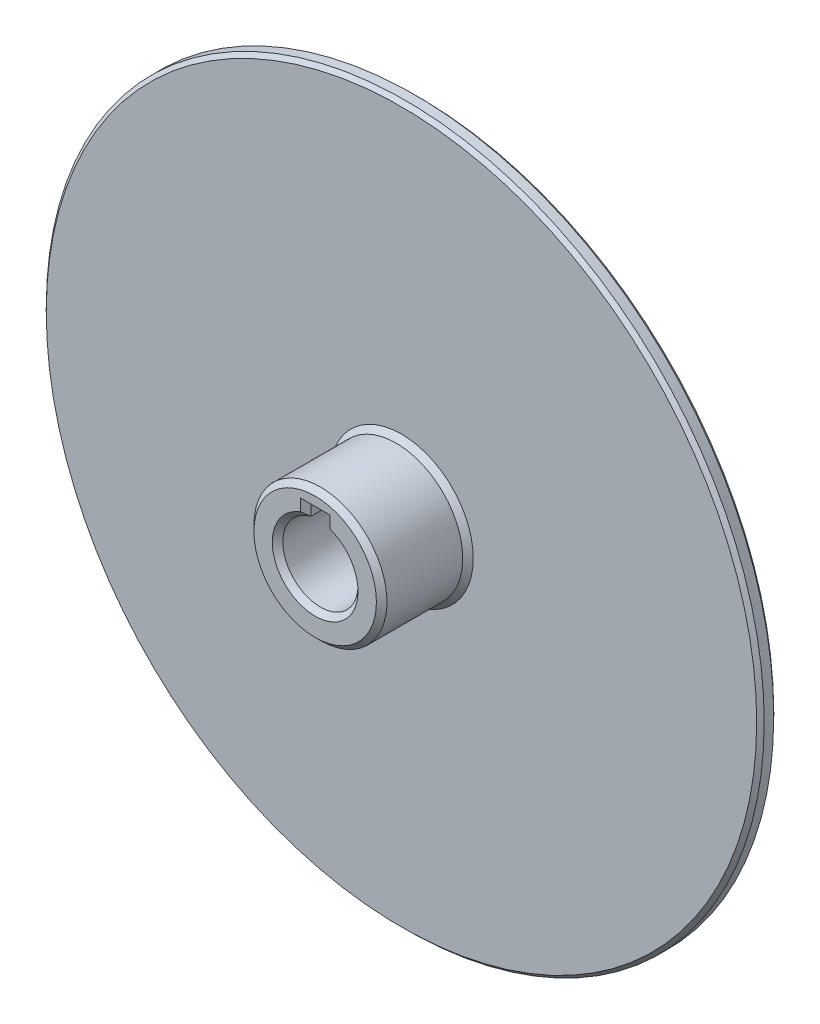
ISO-10303-21;
HEADER;
FILE_DESCRIPTION(('STEP AP214'),'2;1');
FILE_NAME('part.step','',(''),(''),'','','');
FILE_SCHEMA(('AUTOMOTIVE_DESIGN { 1 0 10303 214 1 1 1 1 }'));
ENDSEC;
DATA;
#1=APPLICATION_CONTEXT('core data for automotive mechanical design processes');
#2=APPLICATION_PROTOCOL_DEFINITION('international standard','automotive_design',2000,#1);
#3=PRODUCT_CONTEXT('',#1,'mechanical');
#4=PRODUCT('Part','Part','',(#3));
#5=PRODUCT_RELATED_PRODUCT_CATEGORY('part','',(#4));
#6=PRODUCT_DEFINITION_FORMATION('','',#4);
#7=PRODUCT_DEFINITION_CONTEXT('part definition',#1,'design');
#8=PRODUCT_DEFINITION('design','',#6,#7);
#9=PRODUCT_DEFINITION_SHAPE('','',#8);
#10=(LENGTH_UNIT() NAMED_UNIT(*) SI_UNIT(.MILLI.,.METRE.));
#11=(NAMED_UNIT(*) PLANE_ANGLE_UNIT() SI_UNIT($,.RADIAN.));
#12=(NAMED_UNIT(*) SI_UNIT($,.STERADIAN.) SOLID_ANGLE_UNIT());
#13=UNCERTAINTY_MEASURE_WITH_UNIT(LENGTH_MEASURE(1.E-05),#10,'distance_accuracy_value','');
#14=(GEOMETRIC_REPRESENTATION_CONTEXT(3) GLOBAL_UNCERTAINTY_ASSIGNED_CONTEXT((#13)) GLOBAL_UNIT_ASSIGNED_CONTEXT((#10,
#11,#12)) REPRESENTATION_CONTEXT('',''));
#15=CARTESIAN_POINT('',(0.,0.,0.));
#16=DIRECTION('',(0.,0.,1.));
#17=DIRECTION('',(1.,0.,0.));
#18=AXIS2_PLACEMENT_3D('',#15,#16,#17);
#19=CARTESIAN_POINT('',(0.,0.,5.7658));
#20=DIRECTION('',(0.,0.,-1.));
#21=DIRECTION('',(-1.,0.,0.));
#22=AXIS2_PLACEMENT_3D('',#19,#20,#21);
#23=CYLINDRICAL_SURFACE('',#22,121.3314985735);
#24=CARTESIAN_POINT('',(0.,0.,1.27000000000012));
#25=DIRECTION('',(0.,0.,1.));
#26=DIRECTION('',(1.,0.,0.));
#27=AXIS2_PLACEMENT_3D('',#24,#25,#26);
#28=CIRCLE('',#27,121.3314985735);
#29=CARTESIAN_POINT('',(-121.3314985735,0.,1.27000000000012));
#30=VERTEX_POINT('',#29);
#31=EDGE_CURVE('E329',#30,#30,#28,.T.);
#32=CARTESIAN_POINT('',(0.,0.,4.49580000000024));
#33=DIRECTION('',(0.,0.,1.));
#34=DIRECTION('',(1.,0.,0.));
#35=AXIS2_PLACEMENT_3D('',#32,#33,#34);
#36=CIRCLE('',#35,121.3314985735);
#37=CARTESIAN_POINT('',(-121.3314985735,0.,4.49580000000024));
#38=VERTEX_POINT('',#37);
#39=EDGE_CURVE('E320',#38,#38,#36,.F.);
#40=CARTESIAN_POINT('',(-121.3314985735,0.,1.27000000000012));
#41=CARTESIAN_POINT('',(-121.3314985735,0.,1.30360208333345));
#42=CARTESIAN_POINT('',(-121.3314985735,0.,1.33720416666679));
#43=CARTESIAN_POINT('',(-121.3314985735,0.,1.40440833333346));
#44=CARTESIAN_POINT('',(-121.3314985735,0.,1.43801041666679));
#45=CARTESIAN_POINT('',(-121.3314985735,0.,1.50521458333346));
#46=CARTESIAN_POINT('',(-121.3314985735,0.,1.53881666666679));
#47=CARTESIAN_POINT('',(-121.3314985735,0.,1.60602083333346));
#48=CARTESIAN_POINT('',(-121.3314985735,0.,1.6396229166668));
#49=CARTESIAN_POINT('',(-121.3314985735,0.,1.70682708333347));
#50=CARTESIAN_POINT('',(-121.3314985735,0.,1.7404291666668));
#51=CARTESIAN_POINT('',(-121.3314985735,0.,1.80763333333347));
#52=CARTESIAN_POINT('',(-121.3314985735,0.,1.84123541666681));
#53=CARTESIAN_POINT('',(-121.3314985735,0.,1.90843958333348));
#54=CARTESIAN_POINT('',(-121.3314985735,0.,1.94204166666681));
#55=CARTESIAN_POINT('',(-121.3314985735,0.,2.00924583333348));
#56=CARTESIAN_POINT('',(-121.3314985735,0.,2.04284791666681));
#57=CARTESIAN_POINT('',(-121.3314985735,0.,2.11005208333348));
#58=CARTESIAN_POINT('',(-121.3314985735,0.,2.14365416666682));
#59=CARTESIAN_POINT('',(-121.3314985735,0.,2.21085833333349));
#60=CARTESIAN_POINT('',(-121.3314985735,0.,2.24446041666682));
#61=CARTESIAN_POINT('',(-121.3314985735,0.,2.31166458333349));
#62=CARTESIAN_POINT('',(-121.3314985735,0.,2.34526666666683));
#63=CARTESIAN_POINT('',(-121.3314985735,0.,2.41247083333349));
#64=CARTESIAN_POINT('',(-121.3314985735,0.,2.44607291666683));
#65=CARTESIAN_POINT('',(-121.3314985735,0.,2.5132770833335));
#66=CARTESIAN_POINT('',(-121.3314985735,0.,2.54687916666683));
#67=CARTESIAN_POINT('',(-121.3314985735,0.,2.6140833333335));
#68=CARTESIAN_POINT('',(-121.3314985735,0.,2.64768541666684));
#69=CARTESIAN_POINT('',(-121.3314985735,0.,2.71488958333351));
#70=CARTESIAN_POINT('',(-121.3314985735,0.,2.74849166666684));
#71=CARTESIAN_POINT('',(-121.3314985735,0.,2.81569583333351));
#72=CARTESIAN_POINT('',(-121.3314985735,0.,2.84929791666684));
#73=CARTESIAN_POINT('',(-121.3314985735,0.,2.91650208333351));
#74=CARTESIAN_POINT('',(-121.3314985735,0.,2.95010416666685));
#75=CARTESIAN_POINT('',(-121.3314985735,0.,3.01730833333352));
#76=CARTESIAN_POINT('',(-121.3314985735,0.,3.05091041666685));
#77=CARTESIAN_POINT('',(-121.3314985735,0.,3.11811458333352));
#78=CARTESIAN_POINT('',(-121.3314985735,0.,3.15171666666686));
#79=CARTESIAN_POINT('',(-121.3314985735,0.,3.21892083333353));
#80=CARTESIAN_POINT('',(-121.3314985735,0.,3.25252291666686));
#81=CARTESIAN_POINT('',(-121.3314985735,0.,3.31972708333353));
#82=CARTESIAN_POINT('',(-121.3314985735,0.,3.35332916666686));
#83=CARTESIAN_POINT('',(-121.3314985735,0.,3.42053333333353));
#84=CARTESIAN_POINT('',(-121.3314985735,0.,3.45413541666687));
#85=CARTESIAN_POINT('',(-121.3314985735,0.,3.52133958333354));
#86=CARTESIAN_POINT('',(-121.3314985735,0.,3.55494166666687));
#87=CARTESIAN_POINT('',(-121.3314985735,0.,3.62214583333354));
#88=CARTESIAN_POINT('',(-121.3314985735,0.,3.65574791666688));
#89=CARTESIAN_POINT('',(-121.3314985735,0.,3.72295208333355));
#90=CARTESIAN_POINT('',(-121.3314985735,0.,3.75655416666688));
#91=CARTESIAN_POINT('',(-121.3314985735,0.,3.82375833333355));
#92=CARTESIAN_POINT('',(-121.3314985735,0.,3.85736041666688));
#93=CARTESIAN_POINT('',(-121.3314985735,0.,3.92456458333355));
#94=CARTESIAN_POINT('',(-121.3314985735,0.,3.95816666666689));
#95=CARTESIAN_POINT('',(-121.3314985735,0.,4.02537083333356));
#96=CARTESIAN_POINT('',(-121.3314985735,0.,4.05897291666689));
#97=CARTESIAN_POINT('',(-121.3314985735,0.,4.12617708333356));
#98=CARTESIAN_POINT('',(-121.3314985735,0.,4.1597791666669));
#99=CARTESIAN_POINT('',(-121.3314985735,0.,4.22698333333356));
#100=CARTESIAN_POINT('',(-121.3314985735,0.,4.2605854166669));
#101=CARTESIAN_POINT('',(-121.3314985735,0.,4.32778958333357));
#102=CARTESIAN_POINT('',(-121.3314985735,0.,4.3613916666669));
#103=CARTESIAN_POINT('',(-121.3314985735,0.,4.42859583333357));
#104=CARTESIAN_POINT('',(-121.3314985735,0.,4.46219791666691));
#105=CARTESIAN_POINT('',(-121.3314985735,0.,4.49580000000024));
#106=B_SPLINE_CURVE_WITH_KNOTS('',3,(#40,#41,#42,#43,#44,#45,#46,#47,#48,#49,#50,#51,#52,#53,
#54,#55,#56,#57,#58,#59,#60,#61,#62,#63,#64,#65,#66,#67,#68,#69,#70,#71,#72,#73,#74,#75,#76,#77,
#78,#79,#80,#81,#82,#83,#84,#85,#86,#87,#88,#89,#90,#91,#92,#93,#94,#95,#96,#97,#98,#99,#100,
#101,#102,#103,#104,#105),.UNSPECIFIED.,.F.,.F.,(4,2,2,2,2,2,2,2,2,2,2,2,2,2,2,2,2,2,2,2,2,2,2,
2,2,2,2,2,2,2,2,2,4),(0.,0.100806250000003,0.201612500000008,0.302418750000011,
0.403225000000016,0.504031250000019,0.604837500000023,0.705643750000027,0.806450000000031,
0.907256250000035,1.00806250000004,1.10886875000004,1.20967500000005,1.31048125000005,
1.41128750000005,1.51209375000006,1.61290000000006,1.71370625000007,1.81451250000007,
1.91531875000007,2.01612500000008,2.11693125000008,2.21773750000009,2.31854375000009,
2.41935000000009,2.5201562500001,2.6209625000001,2.7217687500001,2.82257500000011,
2.92338125000011,3.02418750000012,3.12499375000012,3.22580000000012),.UNSPECIFIED.);
#107=EDGE_CURVE('BSEAM47',#30,#38,#106,.T.);
#108=ORIENTED_EDGE('',*,*,#31,.T.);
#109=ORIENTED_EDGE('',*,*,#39,.T.);
#110=ORIENTED_EDGE('',*,*,#107,.T.);
#111=ORIENTED_EDGE('',*,*,#107,.F.);
#112=EDGE_LOOP('',(#108,#110,#109,#111));
#113=FACE_BOUND('',#112,.T.);
#114=ADVANCED_FACE('F47',(#113),#23,.T.);
#115=CARTESIAN_POINT('',(0.,0.,5.7658));
#116=DIRECTION('',(0.,0.,1.));
#117=DIRECTION('',(1.,0.,0.));
#118=AXIS2_PLACEMENT_3D('',#115,#116,#117);
#119=PLANE('',#118);
#120=CARTESIAN_POINT('',(0.,0.,5.7658));
#121=DIRECTION('',(0.,0.,1.));
#122=DIRECTION('',(1.,0.,0.));
#123=AXIS2_PLACEMENT_3D('',#120,#121,#122);
#124=CIRCLE('',#123,24.2570000000002);
#125=CARTESIAN_POINT('',(24.2570000000002,0.,5.7658));
#126=VERTEX_POINT('',#125);
#127=EDGE_CURVE('E11',#126,#126,#124,.F.);
#128=ORIENTED_EDGE('',*,*,#127,.T.);
#129=EDGE_LOOP('',(#128));
#130=FACE_BOUND('',#129,.T.);
#131=CARTESIAN_POINT('',(0.,0.,5.7658));
#132=DIRECTION('',(0.,0.,1.));
#133=DIRECTION('',(1.,0.,0.));
#134=AXIS2_PLACEMENT_3D('',#131,#132,#133);
#135=CIRCLE('',#134,120.0614985735);
#136=CARTESIAN_POINT('',(120.0614985735,0.,5.7658));
#137=VERTEX_POINT('',#136);
#138=EDGE_CURVE('E144',#137,#137,#135,.T.);
#139=ORIENTED_EDGE('',*,*,#138,.T.);
#140=EDGE_LOOP('',(#139));
#141=FACE_BOUND('',#140,.T.);
#142=ADVANCED_FACE('F292',(#130,#141),#119,.T.);
#143=CARTESIAN_POINT('',(0.,0.,0.));
#144=DIRECTION('',(0.,0.,1.));
#145=DIRECTION('',(1.,0.,0.));
#146=AXIS2_PLACEMENT_3D('',#143,#144,#145);
#147=PLANE('',#146);
#148=CARTESIAN_POINT('',(0.,0.,0.));
#149=DIRECTION('',(0.,0.,1.));
#150=DIRECTION('',(1.,0.,0.));
#151=AXIS2_PLACEMENT_3D('',#148,#149,#150);
#152=CIRCLE('',#151,14.478);
#153=CARTESIAN_POINT('',(-4.953,13.6044211563741,0.));
#154=VERTEX_POINT('',#153);
#155=CARTESIAN_POINT('',(4.953,13.6044211563741,0.));
#156=VERTEX_POINT('',#155);
#157=EDGE_CURVE('E149',#154,#156,#152,.T.);
#158=ORIENTED_EDGE('',*,*,#157,.T.);
#159=DIRECTION('',(0.,1.,0.));
#160=VECTOR('',#159,1.);
#161=CARTESIAN_POINT('',(4.953,0.,0.));
#162=LINE('',#161,#160);
#163=CARTESIAN_POINT('',(4.953,17.653,0.));
#164=VERTEX_POINT('',#163);
#165=EDGE_CURVE('E127',#156,#164,#162,.T.);
#166=ORIENTED_EDGE('',*,*,#165,.T.);
#167=DIRECTION('',(-1.,0.,0.));
#168=VECTOR('',#167,1.);
#169=CARTESIAN_POINT('',(0.,17.653,0.));
#170=LINE('',#169,#168);
#171=CARTESIAN_POINT('',(-4.953,17.653,0.));
#172=VERTEX_POINT('',#171);
#173=EDGE_CURVE('E136',#164,#172,#170,.T.);
#174=ORIENTED_EDGE('',*,*,#173,.T.);
#175=DIRECTION('',(0.,-1.,0.));
#176=VECTOR('',#175,1.);
#177=CARTESIAN_POINT('',(-4.953,0.,0.));
#178=LINE('',#177,#176);
#179=EDGE_CURVE('E143',#172,#154,#178,.T.);
#180=ORIENTED_EDGE('',*,*,#179,.T.);
#181=EDGE_LOOP('',(#158,#166,#174,#180));
#182=FACE_BOUND('',#181,.T.);
#183=CARTESIAN_POINT('',(0.,0.,0.));
#184=DIRECTION('',(0.,0.,1.));
#185=DIRECTION('',(1.,0.,0.));
#186=AXIS2_PLACEMENT_3D('',#183,#184,#185);
#187=CIRCLE('',#186,120.0614985735);
#188=CARTESIAN_POINT('',(120.0614985735,0.,0.));
#189=VERTEX_POINT('',#188);
#190=EDGE_CURVE('E325',#189,#189,#187,.F.);
#191=ORIENTED_EDGE('',*,*,#190,.T.);
#192=EDGE_LOOP('',(#191));
#193=FACE_BOUND('',#192,.T.);
#194=ADVANCED_FACE('F146',(#182,#193),#147,.F.);
#195=CARTESIAN_POINT('',(0.,0.,34.940748));
#196=DIRECTION('',(0.,0.,-1.));
#197=DIRECTION('',(-1.,0.,0.));
#198=AXIS2_PLACEMENT_3D('',#195,#196,#197);
#199=CYLINDRICAL_SURFACE('',#198,22.479);
#200=CARTESIAN_POINT('',(0.,0.,7.54380000000021));
#201=DIRECTION('',(0.,0.,1.));
#202=DIRECTION('',(1.,0.,0.));
#203=AXIS2_PLACEMENT_3D('',#200,#201,#202);
#204=CIRCLE('',#203,22.479);
#205=CARTESIAN_POINT('',(-22.479,0.,7.54380000000021));
#206=VERTEX_POINT('',#205);
#207=EDGE_CURVE('E64',#206,#206,#204,.T.);
#208=CARTESIAN_POINT('',(0.,0.,33.1627480000002));
#209=DIRECTION('',(0.,0.,1.));
#210=DIRECTION('',(1.,0.,0.));
#211=AXIS2_PLACEMENT_3D('',#208,#209,#210);
#212=CIRCLE('',#211,22.479);
#213=CARTESIAN_POINT('',(-22.479,0.,33.1627480000002));
#214=VERTEX_POINT('',#213);
#215=EDGE_CURVE('E195',#214,#214,#212,.F.);
#216=CARTESIAN_POINT('',(-22.479,0.,7.54380000000021));
#217=CARTESIAN_POINT('',(-22.479,0.,7.81066404166687));
#218=CARTESIAN_POINT('',(-22.479,0.,8.07752808333354));
#219=CARTESIAN_POINT('',(-22.479,0.,8.61125616666687));
#220=CARTESIAN_POINT('',(-22.479,0.,8.87812020833354));
#221=CARTESIAN_POINT('',(-22.479,0.,9.41184829166687));
#222=CARTESIAN_POINT('',(-22.479,0.,9.67871233333354));
#223=CARTESIAN_POINT('',(-22.479,0.,10.2124404166669));
#224=CARTESIAN_POINT('',(-22.479,0.,10.4793044583335));
#225=CARTESIAN_POINT('',(-22.479,0.,11.0130325416669));
#226=CARTESIAN_POINT('',(-22.479,0.,11.2798965833335));
#227=CARTESIAN_POINT('',(-22.479,0.,11.8136246666669));
#228=CARTESIAN_POINT('',(-22.479,0.,12.0804887083335));
#229=CARTESIAN_POINT('',(-22.479,0.,12.6142167916669));
#230=CARTESIAN_POINT('',(-22.479,0.,12.8810808333335));
#231=CARTESIAN_POINT('',(-22.479,0.,13.4148089166669));
#232=CARTESIAN_POINT('',(-22.479,0.,13.6816729583335));
#233=CARTESIAN_POINT('',(-22.479,0.,14.2154010416669));
#234=CARTESIAN_POINT('',(-22.479,0.,14.4822650833335));
#235=CARTESIAN_POINT('',(-22.479,0.,15.0159931666669));
#236=CARTESIAN_POINT('',(-22.479,0.,15.2828572083335));
#237=CARTESIAN_POINT('',(-22.479,0.,15.8165852916669));
#238=CARTESIAN_POINT('',(-22.479,0.,16.0834493333335));
#239=CARTESIAN_POINT('',(-22.479,0.,16.6171774166669));
#240=CARTESIAN_POINT('',(-22.479,0.,16.8840414583335));
#241=CARTESIAN_POINT('',(-22.479,0.,17.4177695416669));
#242=CARTESIAN_POINT('',(-22.479,0.,17.6846335833335));
#243=CARTESIAN_POINT('',(-22.479,0.,18.2183616666669));
#244=CARTESIAN_POINT('',(-22.479,0.,18.4852257083335));
#245=CARTESIAN_POINT('',(-22.479,0.,19.0189537916669));
#246=CARTESIAN_POINT('',(-22.479,0.,19.2858178333335));
#247=CARTESIAN_POINT('',(-22.479,0.,19.8195459166669));
#248=CARTESIAN_POINT('',(-22.479,0.,20.0864099583335));
#249=CARTESIAN_POINT('',(-22.479,0.,20.6201380416669));
#250=CARTESIAN_POINT('',(-22.479,0.,20.8870020833335));
#251=CARTESIAN_POINT('',(-22.479,0.,21.4207301666669));
#252=CARTESIAN_POINT('',(-22.479,0.,21.6875942083335));
#253=CARTESIAN_POINT('',(-22.479,0.,22.2213222916669));
#254=CARTESIAN_POINT('',(-22.479,0.,22.4881863333335));
#255=CARTESIAN_POINT('',(-22.479,0.,23.0219144166669));
#256=CARTESIAN_POINT('',(-22.479,0.,23.2887784583335));
#257=CARTESIAN_POINT('',(-22.479,0.,23.8225065416669));
#258=CARTESIAN_POINT('',(-22.479,0.,24.0893705833335));
#259=CARTESIAN_POINT('',(-22.479,0.,24.6230986666669));
#260=CARTESIAN_POINT('',(-22.479,0.,24.8899627083335));
#261=CARTESIAN_POINT('',(-22.479,0.,25.4236907916669));
#262=CARTESIAN_POINT('',(-22.479,0.,25.6905548333335));
#263=CARTESIAN_POINT('',(-22.479,0.,26.2242829166669));
#264=CARTESIAN_POINT('',(-22.479,0.,26.4911469583335));
#265=CARTESIAN_POINT('',(-22.479,0.,27.0248750416668));
#266=CARTESIAN_POINT('',(-22.479,0.,27.2917390833335));
#267=CARTESIAN_POINT('',(-22.479,0.,27.8254671666668));
#268=CARTESIAN_POINT('',(-22.479,0.,28.0923312083335));
#269=CARTESIAN_POINT('',(-22.479,0.,28.6260592916668));
#270=CARTESIAN_POINT('',(-22.479,0.,28.8929233333335));
#271=CARTESIAN_POINT('',(-22.479,0.,29.4266514166668));
#272=CARTESIAN_POINT('',(-22.479,0.,29.6935154583335));
#273=CARTESIAN_POINT('',(-22.479,0.,30.2272435416668));
#274=CARTESIAN_POINT('',(-22.479,0.,30.4941075833335));
#275=CARTESIAN_POINT('',(-22.479,0.,31.0278356666668));
#276=CARTESIAN_POINT('',(-22.479,0.,31.2946997083335));
#277=CARTESIAN_POINT('',(-22.479,0.,31.8284277916669));
#278=CARTESIAN_POINT('',(-22.479,0.,32.0952918333335));
#279=CARTESIAN_POINT('',(-22.479,0.,32.6290199166668));
#280=CARTESIAN_POINT('',(-22.479,0.,32.8958839583335));
#281=CARTESIAN_POINT('',(-22.479,0.,33.1627480000002));
#282=B_SPLINE_CURVE_WITH_KNOTS('',3,(#216,#217,#218,#219,#220,#221,#222,#223,#224,#225,#226,
#227,#228,#229,#230,#231,#232,#233,#234,#235,#236,#237,#238,#239,#240,#241,#242,#243,#244,#245,
#246,#247,#248,#249,#250,#251,#252,#253,#254,#255,#256,#257,#258,#259,#260,#261,#262,#263,#264,
#265,#266,#267,#268,#269,#270,#271,#272,#273,#274,#275,#276,#277,#278,#279,#280,#281),
.UNSPECIFIED.,.F.,.F.,(4,2,2,2,2,2,2,2,2,2,2,2,2,2,2,2,2,2,2,2,2,2,2,2,2,2,2,2,2,2,2,2,4),(0.,
0.800592124999999,1.60118425,2.401776375,3.2023685,4.002960625,4.80355275,5.60414487499999,
6.40473699999999,7.20532912499999,8.00592124999999,8.80651337499999,9.60710549999999,
10.407697625,11.20828975,12.008881875,12.809474,13.610066125,14.41065825,15.211250375,
16.0118425,16.812434625,17.61302675,18.413618875,19.214211,20.014803125,20.81539525,
21.615987375,22.4165795,23.217171625,24.01776375,24.818355875,25.618948),.UNSPECIFIED.);
#283=EDGE_CURVE('BSEAM395',#206,#214,#282,.T.);
#284=ORIENTED_EDGE('',*,*,#207,.T.);
#285=ORIENTED_EDGE('',*,*,#215,.T.);
#286=ORIENTED_EDGE('',*,*,#283,.T.);
#287=ORIENTED_EDGE('',*,*,#283,.F.);
#288=EDGE_LOOP('',(#284,#286,#285,#287));
#289=FACE_BOUND('',#288,.T.);
#290=ADVANCED_FACE('F395',(#289),#199,.T.);
#291=CARTESIAN_POINT('',(0.,0.,34.940748));
#292=DIRECTION('',(0.,0.,1.));
#293=DIRECTION('',(1.,0.,0.));
#294=AXIS2_PLACEMENT_3D('',#291,#292,#293);
#295=PLANE('',#294);
#296=DIRECTION('',(1.,0.,0.));
#297=VECTOR('',#296,1.);
#298=CARTESIAN_POINT('',(3.175,17.6530000000001,34.940748));
#299=LINE('',#298,#297);
#300=CARTESIAN_POINT('',(-4.9530000000001,17.6530000000001,34.940748));
#301=VERTEX_POINT('',#300);
#302=CARTESIAN_POINT('',(4.9530000000001,17.6530000000001,34.940748));
#303=VERTEX_POINT('',#302);
#304=EDGE_CURVE('E72',#301,#303,#299,.T.);
#305=ORIENTED_EDGE('',*,*,#304,.T.);
#306=DIRECTION('',(0.,-1.,0.));
#307=VECTOR('',#306,1.);
#308=CARTESIAN_POINT('',(4.9530000000001,12.2967221242085,34.940748));
#309=LINE('',#308,#307);
#310=CARTESIAN_POINT('',(4.9530000000001,13.6044211563742,34.940748));
#311=VERTEX_POINT('',#310);
#312=EDGE_CURVE('E192',#303,#311,#309,.T.);
#313=ORIENTED_EDGE('',*,*,#312,.T.);
#314=CARTESIAN_POINT('',(0.,0.,34.940748));
#315=DIRECTION('',(0.,0.,1.));
#316=DIRECTION('',(1.,0.,0.));
#317=AXIS2_PLACEMENT_3D('',#314,#315,#316);
#318=CIRCLE('',#317,14.4780000000001);
#319=CARTESIAN_POINT('',(-4.9530000000001,13.6044211563742,34.940748));
#320=VERTEX_POINT('',#319);
#321=EDGE_CURVE('E185',#311,#320,#318,.F.);
#322=ORIENTED_EDGE('',*,*,#321,.T.);
#323=DIRECTION('',(0.,1.,0.));
#324=VECTOR('',#323,1.);
#325=CARTESIAN_POINT('',(-4.9530000000001,15.875,34.940748));
#326=LINE('',#325,#324);
#327=EDGE_CURVE('E77',#320,#301,#326,.T.);
#328=ORIENTED_EDGE('',*,*,#327,.T.);
#329=EDGE_LOOP('',(#305,#313,#322,#328));
#330=FACE_BOUND('',#329,.T.);
#331=CARTESIAN_POINT('',(0.,0.,34.940748));
#332=DIRECTION('',(0.,0.,1.));
#333=DIRECTION('',(1.,0.,0.));
#334=AXIS2_PLACEMENT_3D('',#331,#332,#333);
#335=CIRCLE('',#334,20.7010000000002);
#336=CARTESIAN_POINT('',(20.7010000000002,0.,34.940748));
#337=VERTEX_POINT('',#336);
#338=EDGE_CURVE('E181',#337,#337,#335,.T.);
#339=ORIENTED_EDGE('',*,*,#338,.T.);
#340=EDGE_LOOP('',(#339));
#341=FACE_BOUND('',#340,.T.);
#342=ADVANCED_FACE('F392',(#330,#341),#295,.T.);
#343=CARTESIAN_POINT('',(0.,0.,0.));
#344=DIRECTION('',(0.,0.,1.));
#345=DIRECTION('',(1.,0.,0.));
#346=AXIS2_PLACEMENT_3D('',#343,#344,#345);
#347=CYLINDRICAL_SURFACE('',#346,12.7);
#348=DIRECTION('',(0.,0.,1.));
#349=VECTOR('',#348,1.);
#350=CARTESIAN_POINT('',(3.175,12.2967221242085,0.));
#351=LINE('',#350,#349);
#352=CARTESIAN_POINT('',(3.175,12.2967221242085,33.1627479999999));
#353=VERTEX_POINT('',#352);
#354=CARTESIAN_POINT('',(3.175,12.2967221242085,1.778));
#355=VERTEX_POINT('',#354);
#356=EDGE_CURVE('E345',#353,#355,#351,.F.);
#357=ORIENTED_EDGE('',*,*,#356,.T.);
#358=CARTESIAN_POINT('',(0.,0.,1.778));
#359=DIRECTION('',(0.,0.,1.));
#360=DIRECTION('',(1.,0.,0.));
#361=AXIS2_PLACEMENT_3D('',#358,#359,#360);
#362=CIRCLE('',#361,12.7);
#363=CARTESIAN_POINT('',(-3.175,12.2967221242086,1.778));
#364=VERTEX_POINT('',#363);
#365=EDGE_CURVE('E166',#355,#364,#362,.F.);
#366=ORIENTED_EDGE('',*,*,#365,.T.);
#367=DIRECTION('',(0.,0.,1.));
#368=VECTOR('',#367,1.);
#369=CARTESIAN_POINT('',(-3.175,12.2967221242086,0.));
#370=LINE('',#369,#368);
#371=CARTESIAN_POINT('',(-3.175,12.2967221242086,33.1627479999999));
#372=VERTEX_POINT('',#371);
#373=EDGE_CURVE('E351',#364,#372,#370,.T.);
#374=ORIENTED_EDGE('',*,*,#373,.T.);
#375=CARTESIAN_POINT('',(0.,0.,33.1627479999999));
#376=DIRECTION('',(0.,0.,1.));
#377=DIRECTION('',(1.,0.,0.));
#378=AXIS2_PLACEMENT_3D('',#375,#376,#377);
#379=CIRCLE('',#378,12.7);
#380=EDGE_CURVE('E163',#372,#353,#379,.T.);
#381=ORIENTED_EDGE('',*,*,#380,.T.);
#382=EDGE_LOOP('',(#357,#366,#374,#381));
#383=FACE_BOUND('',#382,.T.);
#384=ADVANCED_FACE('F348',(#383),#347,.F.);
#385=CARTESIAN_POINT('',(3.175,15.875,0.));
#386=DIRECTION('',(1.,0.,0.));
#387=DIRECTION('',(0.,1.,0.));
#388=AXIS2_PLACEMENT_3D('',#385,#386,#387);
#389=PLANE('',#388);
#390=DIRECTION('',(0.,0.,1.));
#391=VECTOR('',#390,1.);
#392=CARTESIAN_POINT('',(3.175,15.875,0.));
#393=LINE('',#392,#391);
#394=CARTESIAN_POINT('',(3.175,15.875,1.778));
#395=VERTEX_POINT('',#394);
#396=CARTESIAN_POINT('',(3.175,15.875,33.1627479999999));
#397=VERTEX_POINT('',#396);
#398=EDGE_CURVE('E248',#395,#397,#393,.T.);
#399=ORIENTED_EDGE('',*,*,#398,.F.);
#400=DIRECTION('',(0.,-1.,0.));
#401=VECTOR('',#400,1.);
#402=CARTESIAN_POINT('',(3.175,15.875,1.778));
#403=LINE('',#402,#401);
#404=EDGE_CURVE('E129',#395,#355,#403,.T.);
#405=ORIENTED_EDGE('',*,*,#404,.T.);
#406=ORIENTED_EDGE('',*,*,#356,.F.);
#407=DIRECTION('',(0.,1.,0.));
#408=VECTOR('',#407,1.);
#409=CARTESIAN_POINT('',(3.175,15.875,33.1627479999999));
#410=LINE('',#409,#408);
#411=EDGE_CURVE('E152',#353,#397,#410,.T.);
#412=ORIENTED_EDGE('',*,*,#411,.T.);
#413=EDGE_LOOP('',(#399,#405,#406,#412));
#414=FACE_BOUND('',#413,.T.);
#415=ADVANCED_FACE('F344',(#414),#389,.F.);
#416=CARTESIAN_POINT('',(-3.175,15.875,0.));
#417=DIRECTION('',(-1.,0.,0.));
#418=DIRECTION('',(0.,-1.,0.));
#419=AXIS2_PLACEMENT_3D('',#416,#417,#418);
#420=PLANE('',#419);
#421=ORIENTED_EDGE('',*,*,#373,.F.);
#422=DIRECTION('',(0.,1.,0.));
#423=VECTOR('',#422,1.);
#424=CARTESIAN_POINT('',(-3.175,15.875,1.778));
#425=LINE('',#424,#423);
#426=CARTESIAN_POINT('',(-3.175,15.875,1.778));
#427=VERTEX_POINT('',#426);
#428=EDGE_CURVE('E172',#364,#427,#425,.T.);
#429=ORIENTED_EDGE('',*,*,#428,.T.);
#430=DIRECTION('',(0.,0.,1.));
#431=VECTOR('',#430,1.);
#432=CARTESIAN_POINT('',(-3.175,15.875,0.));
#433=LINE('',#432,#431);
#434=CARTESIAN_POINT('',(-3.175,15.875,33.1627479999999));
#435=VERTEX_POINT('',#434);
#436=EDGE_CURVE('E356',#427,#435,#433,.T.);
#437=ORIENTED_EDGE('',*,*,#436,.T.);
#438=DIRECTION('',(0.,-1.,0.));
#439=VECTOR('',#438,1.);
#440=CARTESIAN_POINT('',(-3.175,12.2967221242086,33.1627479999999));
#441=LINE('',#440,#439);
#442=EDGE_CURVE('E169',#435,#372,#441,.T.);
#443=ORIENTED_EDGE('',*,*,#442,.T.);
#444=EDGE_LOOP('',(#421,#429,#437,#443));
#445=FACE_BOUND('',#444,.T.);
#446=ADVANCED_FACE('F369',(#445),#420,.F.);
#447=CARTESIAN_POINT('',(-3.175,15.875,0.));
#448=DIRECTION('',(0.,1.,0.));
#449=DIRECTION('',(0.,0.,1.));
#450=AXIS2_PLACEMENT_3D('',#447,#448,#449);
#451=PLANE('',#450);
#452=ORIENTED_EDGE('',*,*,#436,.F.);
#453=DIRECTION('',(1.,0.,0.));
#454=VECTOR('',#453,1.);
#455=CARTESIAN_POINT('',(-3.175,15.875,1.778));
#456=LINE('',#455,#454);
#457=EDGE_CURVE('E178',#427,#395,#456,.T.);
#458=ORIENTED_EDGE('',*,*,#457,.T.);
#459=ORIENTED_EDGE('',*,*,#398,.T.);
#460=DIRECTION('',(-1.,0.,0.));
#461=VECTOR('',#460,1.);
#462=CARTESIAN_POINT('',(-3.175,15.875,33.1627479999999));
#463=LINE('',#462,#461);
#464=EDGE_CURVE('E175',#397,#435,#463,.T.);
#465=ORIENTED_EDGE('',*,*,#464,.T.);
#466=EDGE_LOOP('',(#452,#458,#459,#465));
#467=FACE_BOUND('',#466,.T.);
#468=ADVANCED_FACE('F309',(#467),#451,.F.);
#469=CARTESIAN_POINT('',(0.,0.,1.27000000000012));
#470=DIRECTION('',(0.,0.,1.));
#471=DIRECTION('',(1.,0.,0.));
#472=AXIS2_PLACEMENT_3D('',#469,#470,#471);
#473=CONICAL_SURFACE('',#472,121.3314985735,0.785398163397454);
#474=ORIENTED_EDGE('',*,*,#190,.F.);
#475=EDGE_LOOP('',(#474));
#476=FACE_BOUND('',#475,.T.);
#477=ORIENTED_EDGE('',*,*,#31,.F.);
#478=EDGE_LOOP('',(#477));
#479=FACE_BOUND('',#478,.T.);
#480=ADVANCED_FACE('F306',(#476,#479),#473,.T.);
#481=CARTESIAN_POINT('',(0.,0.,5.7658));
#482=DIRECTION('',(0.,0.,-1.));
#483=DIRECTION('',(-1.,0.,0.));
#484=AXIS2_PLACEMENT_3D('',#481,#482,#483);
#485=CONICAL_SURFACE('',#484,120.0614985735,0.785398163397465);
#486=ORIENTED_EDGE('',*,*,#39,.F.);
#487=EDGE_LOOP('',(#486));
#488=FACE_BOUND('',#487,.T.);
#489=ORIENTED_EDGE('',*,*,#138,.F.);
#490=EDGE_LOOP('',(#489));
#491=FACE_BOUND('',#490,.T.);
#492=ADVANCED_FACE('F234',(#488,#491),#485,.T.);
#493=CARTESIAN_POINT('',(-4.953,0.,0.));
#494=DIRECTION('',(-0.707106781186547,0.,0.707106781186547));
#495=DIRECTION('',(0.,-1.,0.));
#496=AXIS2_PLACEMENT_3D('',#493,#494,#495);
#497=PLANE('',#496);
#498=DIRECTION('',(-0.577350269189626,0.577350269189626,-0.577350269189626));
#499=VECTOR('',#498,1.);
#500=CARTESIAN_POINT('',(0.931333333333333,11.7686666666667,5.88433333333333));
#501=LINE('',#500,#499);
#502=EDGE_CURVE('E139',#427,#172,#501,.T.);
#503=ORIENTED_EDGE('',*,*,#502,.F.);
#504=ORIENTED_EDGE('',*,*,#428,.F.);
#505=CARTESIAN_POINT('',(-3.175,12.2967221242086,1.778));
#506=CARTESIAN_POINT('',(-3.32149538455012,12.4101940069984,1.63150461544988));
#507=CARTESIAN_POINT('',(-3.46845579215077,12.5224613493286,1.48454420784923));
#508=CARTESIAN_POINT('',(-3.76322224338771,12.7446998132059,1.18977775661229));
#509=CARTESIAN_POINT('',(-3.91102819507323,12.8546711786066,1.04197180492677));
#510=CARTESIAN_POINT('',(-4.20743009001342,13.0724528551513,0.745569909986584));
#511=CARTESIAN_POINT('',(-4.35602601967459,13.1802632033294,0.596973980325414));
#512=CARTESIAN_POINT('',(-4.653968426483,13.3938461600813,0.299031573517005));
#513=CARTESIAN_POINT('',(-4.80331498205428,13.4996185499081,0.149685017945717));
#514=CARTESIAN_POINT('',(-4.953,13.6044211563741,0.));
#515=B_SPLINE_CURVE_WITH_KNOTS('',3,(#505,#506,#507,#508,#509,#510,#511,#512,#513,#514),
.UNSPECIFIED.,.F.,.F.,(4,2,2,2,4),(0.,0.708639237281418,1.41720282374273,2.12575425684842,
2.83438132430985),.UNSPECIFIED.);
#516=EDGE_CURVE('E240',#154,#364,#515,.F.);
#517=ORIENTED_EDGE('',*,*,#516,.F.);
#518=ORIENTED_EDGE('',*,*,#179,.F.);
#519=EDGE_LOOP('',(#503,#504,#517,#518));
#520=FACE_BOUND('',#519,.T.);
#521=ADVANCED_FACE('F228',(#520),#497,.F.);
#522=CARTESIAN_POINT('',(0.,0.,0.));
#523=DIRECTION('',(0.,0.,-1.));
#524=DIRECTION('',(-1.,0.,0.));
#525=AXIS2_PLACEMENT_3D('',#522,#523,#524);
#526=CONICAL_SURFACE('',#525,14.478,0.785398163397448);
#527=ORIENTED_EDGE('',*,*,#516,.T.);
#528=ORIENTED_EDGE('',*,*,#365,.F.);
#529=CARTESIAN_POINT('',(3.175,12.2967221242085,1.778));
#530=CARTESIAN_POINT('',(3.32149538455012,12.4101940069984,1.63150461544988));
#531=CARTESIAN_POINT('',(3.46845579215077,12.5224613493286,1.48454420784923));
#532=CARTESIAN_POINT('',(3.76322224338771,12.7446998132059,1.18977775661229));
#533=CARTESIAN_POINT('',(3.91102819507323,12.8546711786066,1.04197180492677));
#534=CARTESIAN_POINT('',(4.20743009001342,13.0724528551513,0.745569909986584));
#535=CARTESIAN_POINT('',(4.35602601967459,13.1802632033294,0.596973980325414));
#536=CARTESIAN_POINT('',(4.653968426483,13.3938461600813,0.299031573517005));
#537=CARTESIAN_POINT('',(4.80331498205428,13.4996185499081,0.149685017945718));
#538=CARTESIAN_POINT('',(4.953,13.6044211563741,0.));
#539=B_SPLINE_CURVE_WITH_KNOTS('',3,(#529,#530,#531,#532,#533,#534,#535,#536,#537,#538),
.UNSPECIFIED.,.F.,.F.,(4,2,2,2,4),(0.,0.708639237281419,1.41720282374273,2.12575425684842,
2.83438132430985),.UNSPECIFIED.);
#540=EDGE_CURVE('E133',#156,#355,#539,.F.);
#541=ORIENTED_EDGE('',*,*,#540,.F.);
#542=ORIENTED_EDGE('',*,*,#157,.F.);
#543=EDGE_LOOP('',(#527,#528,#541,#542));
#544=FACE_BOUND('',#543,.T.);
#545=ADVANCED_FACE('F212',(#544),#526,.F.);
#546=CARTESIAN_POINT('',(0.,17.653,0.));
#547=DIRECTION('',(0.,0.707106781186547,0.707106781186547));
#548=DIRECTION('',(-1.,0.,0.));
#549=AXIS2_PLACEMENT_3D('',#546,#547,#548);
#550=PLANE('',#549);
#551=ORIENTED_EDGE('',*,*,#502,.T.);
#552=ORIENTED_EDGE('',*,*,#173,.F.);
#553=DIRECTION('',(-0.577350269189626,-0.577350269189626,0.577350269189626));
#554=VECTOR('',#553,1.);
#555=CARTESIAN_POINT('',(-0.931333333333331,11.7686666666667,5.88433333333333));
#556=LINE('',#555,#554);
#557=EDGE_CURVE('E123',#395,#164,#556,.F.);
#558=ORIENTED_EDGE('',*,*,#557,.F.);
#559=ORIENTED_EDGE('',*,*,#457,.F.);
#560=EDGE_LOOP('',(#551,#552,#558,#559));
#561=FACE_BOUND('',#560,.T.);
#562=ADVANCED_FACE('F137',(#561),#550,.F.);
#563=CARTESIAN_POINT('',(4.953,0.,0.));
#564=DIRECTION('',(0.707106781186547,0.,0.707106781186547));
#565=DIRECTION('',(0.,1.,0.));
#566=AXIS2_PLACEMENT_3D('',#563,#564,#565);
#567=PLANE('',#566);
#568=ORIENTED_EDGE('',*,*,#540,.T.);
#569=ORIENTED_EDGE('',*,*,#404,.F.);
#570=ORIENTED_EDGE('',*,*,#557,.T.);
#571=ORIENTED_EDGE('',*,*,#165,.F.);
#572=EDGE_LOOP('',(#568,#569,#570,#571));
#573=FACE_BOUND('',#572,.T.);
#574=ADVANCED_FACE('F125',(#573),#567,.F.);
#575=CARTESIAN_POINT('',(-3.175,15.875,33.1627479999999));
#576=DIRECTION('',(0.707106781186552,0.,0.707106781186543));
#577=DIRECTION('',(0.,1.,0.));
#578=AXIS2_PLACEMENT_3D('',#575,#576,#577);
#579=PLANE('',#578);
#580=DIRECTION('',(-0.577350269189623,0.577350269189623,0.577350269189631));
#581=VECTOR('',#580,1.);
#582=CARTESIAN_POINT('',(-3.175,15.875,33.1627479999999));
#583=LINE('',#582,#581);
#584=EDGE_CURVE('E258',#301,#435,#583,.F.);
#585=ORIENTED_EDGE('',*,*,#584,.F.);
#586=ORIENTED_EDGE('',*,*,#327,.F.);
#587=CARTESIAN_POINT('',(-3.175,12.2967221242086,33.1627479999999));
#588=CARTESIAN_POINT('',(-3.32149538455013,12.4101940069984,33.30924338455));
#589=CARTESIAN_POINT('',(-3.46845579215079,12.5224613493286,33.4562037921507));
#590=CARTESIAN_POINT('',(-3.76322224338774,12.7446998132059,33.7509702433876));
#591=CARTESIAN_POINT('',(-3.91102819507327,12.8546711786067,33.8987761950732));
#592=CARTESIAN_POINT('',(-4.20743009001347,13.0724528551513,34.1951780900134));
#593=CARTESIAN_POINT('',(-4.35602601967465,13.1802632033294,34.3437740196745));
#594=CARTESIAN_POINT('',(-4.65396842648308,13.3938461600814,34.641716426483));
#595=CARTESIAN_POINT('',(-4.80331498205438,13.4996185499082,34.7910629820543));
#596=CARTESIAN_POINT('',(-4.9530000000001,13.6044211563742,34.940748));
#597=B_SPLINE_CURVE_WITH_KNOTS('',3,(#587,#588,#589,#590,#591,#592,#593,#594,#595,#596),
.UNSPECIFIED.,.F.,.F.,(4,2,2,2,4),(0.,0.708639237281462,1.41720282374281,2.12575425684855,
2.83438132431003),.UNSPECIFIED.);
#598=EDGE_CURVE('E52',#372,#320,#597,.T.);
#599=ORIENTED_EDGE('',*,*,#598,.F.);
#600=ORIENTED_EDGE('',*,*,#442,.F.);
#601=EDGE_LOOP('',(#585,#586,#599,#600));
#602=FACE_BOUND('',#601,.T.);
#603=ADVANCED_FACE('F222',(#602),#579,.T.);
#604=CARTESIAN_POINT('',(0.,0.,33.1627479999999));
#605=DIRECTION('',(0.,0.,1.));
#606=DIRECTION('',(1.,0.,0.));
#607=AXIS2_PLACEMENT_3D('',#604,#605,#606);
#608=CONICAL_SURFACE('',#607,12.7,0.785398163397442);
#609=ORIENTED_EDGE('',*,*,#598,.T.);
#610=ORIENTED_EDGE('',*,*,#321,.F.);
#611=CARTESIAN_POINT('',(4.9530000000001,13.6044211563742,34.940748));
#612=CARTESIAN_POINT('',(4.80331498205438,13.4996185499082,34.7910629820543));
#613=CARTESIAN_POINT('',(4.65396842648308,13.3938461600814,34.641716426483));
#614=CARTESIAN_POINT('',(4.35602601967466,13.1802632033294,34.3437740196745));
#615=CARTESIAN_POINT('',(4.20743009001348,13.0724528551513,34.1951780900134));
#616=CARTESIAN_POINT('',(3.91102819507327,12.8546711786067,33.8987761950732));
#617=CARTESIAN_POINT('',(3.76322224338775,12.7446998132059,33.7509702433876));
#618=CARTESIAN_POINT('',(3.46845579215079,12.5224613493286,33.4562037921507));
#619=CARTESIAN_POINT('',(3.32149538455013,12.4101940069984,33.30924338455));
#620=CARTESIAN_POINT('',(3.175,12.2967221242085,33.1627479999999));
#621=B_SPLINE_CURVE_WITH_KNOTS('',3,(#611,#612,#613,#614,#615,#616,#617,#618,#619,#620),
.UNSPECIFIED.,.F.,.F.,(4,2,2,2,4),(0.,0.708627067461469,1.41717850056721,2.12574208702857,
2.83438132431003),.UNSPECIFIED.);
#622=EDGE_CURVE('E252',#353,#311,#621,.F.);
#623=ORIENTED_EDGE('',*,*,#622,.F.);
#624=ORIENTED_EDGE('',*,*,#380,.F.);
#625=EDGE_LOOP('',(#609,#610,#623,#624));
#626=FACE_BOUND('',#625,.T.);
#627=ADVANCED_FACE('F237',(#626),#608,.F.);
#628=CARTESIAN_POINT('',(-3.175,15.875,33.1627479999999));
#629=DIRECTION('',(0.,-0.707106781186552,0.707106781186543));
#630=DIRECTION('',(1.,0.,0.));
#631=AXIS2_PLACEMENT_3D('',#628,#629,#630);
#632=PLANE('',#631);
#633=ORIENTED_EDGE('',*,*,#584,.T.);
#634=ORIENTED_EDGE('',*,*,#464,.F.);
#635=DIRECTION('',(0.577350269189623,0.577350269189623,0.577350269189631));
#636=VECTOR('',#635,1.);
#637=CARTESIAN_POINT('',(3.175,15.875,33.1627479999999));
#638=LINE('',#637,#636);
#639=EDGE_CURVE('E249',#303,#397,#638,.F.);
#640=ORIENTED_EDGE('',*,*,#639,.F.);
#641=ORIENTED_EDGE('',*,*,#304,.F.);
#642=EDGE_LOOP('',(#633,#634,#640,#641));
#643=FACE_BOUND('',#642,.T.);
#644=ADVANCED_FACE('F268',(#643),#632,.T.);
#645=CARTESIAN_POINT('',(3.175,15.875,33.1627479999999));
#646=DIRECTION('',(-0.707106781186552,0.,0.707106781186543));
#647=DIRECTION('',(0.,-1.,0.));
#648=AXIS2_PLACEMENT_3D('',#645,#646,#647);
#649=PLANE('',#648);
#650=ORIENTED_EDGE('',*,*,#622,.T.);
#651=ORIENTED_EDGE('',*,*,#312,.F.);
#652=ORIENTED_EDGE('',*,*,#639,.T.);
#653=ORIENTED_EDGE('',*,*,#411,.F.);
#654=EDGE_LOOP('',(#650,#651,#652,#653));
#655=FACE_BOUND('',#654,.T.);
#656=ADVANCED_FACE('F260',(#655),#649,.T.);
#657=CARTESIAN_POINT('',(0.,0.,7.54380000000021));
#658=DIRECTION('',(0.,0.,-1.));
#659=DIRECTION('',(-1.,0.,0.));
#660=AXIS2_PLACEMENT_3D('',#657,#658,#659);
#661=CONICAL_SURFACE('',#660,22.479,0.785398163397443);
#662=ORIENTED_EDGE('',*,*,#127,.F.);
#663=EDGE_LOOP('',(#662));
#664=FACE_BOUND('',#663,.T.);
#665=ORIENTED_EDGE('',*,*,#207,.F.);
#666=EDGE_LOOP('',(#665));
#667=FACE_BOUND('',#666,.T.);
#668=ADVANCED_FACE('F267',(#664,#667),#661,.T.);
#669=CARTESIAN_POINT('',(0.,0.,34.940748));
#670=DIRECTION('',(0.,0.,-1.));
#671=DIRECTION('',(-1.,0.,0.));
#672=AXIS2_PLACEMENT_3D('',#669,#670,#671);
#673=CONICAL_SURFACE('',#672,20.7010000000002,0.785398163397445);
#674=ORIENTED_EDGE('',*,*,#215,.F.);
#675=EDGE_LOOP('',(#674));
#676=FACE_BOUND('',#675,.T.);
#677=ORIENTED_EDGE('',*,*,#338,.F.);
#678=EDGE_LOOP('',(#677));
#679=FACE_BOUND('',#678,.T.);
#680=ADVANCED_FACE('F50',(#676,#679),#673,.T.);
#681=CLOSED_SHELL('',(#114,#142,#194,#290,#342,#384,#415,#446,#468,#480,#492,#521,#545,#562,
#574,#603,#627,#644,#656,#668,#680));
#682=MANIFOLD_SOLID_BREP('B2',#681);
#683=ADVANCED_BREP_SHAPE_REPRESENTATION('',(#18,#682),#14);
#684=SHAPE_DEFINITION_REPRESENTATION(#9,#683);
ENDSEC;
END-ISO-10303-21;
